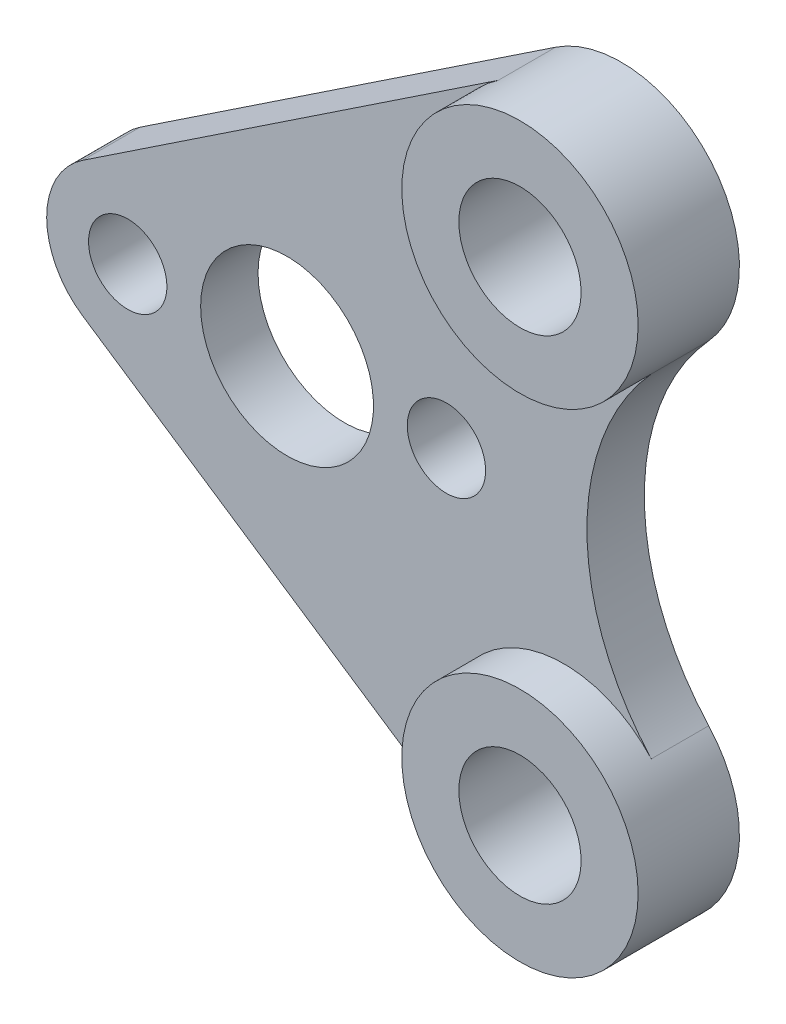
ISO-10303-21;
HEADER;
FILE_DESCRIPTION(('STEP AP214'),'2;1');
FILE_NAME('part.step','',(''),(''),'','','');
FILE_SCHEMA(('AUTOMOTIVE_DESIGN { 1 0 10303 214 1 1 1 1 }'));
ENDSEC;
DATA;
#1=APPLICATION_CONTEXT('core data for automotive mechanical design processes');
#2=APPLICATION_PROTOCOL_DEFINITION('international standard','automotive_design',2000,#1);
#3=PRODUCT_CONTEXT('',#1,'mechanical');
#4=PRODUCT('Part','Part','',(#3));
#5=PRODUCT_RELATED_PRODUCT_CATEGORY('part','',(#4));
#6=PRODUCT_DEFINITION_FORMATION('','',#4);
#7=PRODUCT_DEFINITION_CONTEXT('part definition',#1,'design');
#8=PRODUCT_DEFINITION('design','',#6,#7);
#9=PRODUCT_DEFINITION_SHAPE('','',#8);
#10=(LENGTH_UNIT() NAMED_UNIT(*) SI_UNIT(.MILLI.,.METRE.));
#11=(NAMED_UNIT(*) PLANE_ANGLE_UNIT() SI_UNIT($,.RADIAN.));
#12=(NAMED_UNIT(*) SI_UNIT($,.STERADIAN.) SOLID_ANGLE_UNIT());
#13=UNCERTAINTY_MEASURE_WITH_UNIT(LENGTH_MEASURE(1.E-05),#10,'distance_accuracy_value','');
#14=(GEOMETRIC_REPRESENTATION_CONTEXT(3) GLOBAL_UNCERTAINTY_ASSIGNED_CONTEXT((#13)) GLOBAL_UNIT_ASSIGNED_CONTEXT((#10,
#11,#12)) REPRESENTATION_CONTEXT('',''));
#15=CARTESIAN_POINT('',(0.,0.,0.));
#16=DIRECTION('',(0.,0.,1.));
#17=DIRECTION('',(1.,0.,0.));
#18=AXIS2_PLACEMENT_3D('',#15,#16,#17);
#19=CARTESIAN_POINT('',(10.4106540966454,9.2583,3.81));
#20=DIRECTION('',(0.,0.,1.));
#21=DIRECTION('',(1.,0.,0.));
#22=AXIS2_PLACEMENT_3D('',#19,#20,#21);
#23=PLANE('',#22);
#24=CARTESIAN_POINT('',(10.4106540966454,-9.2583,3.81));
#25=DIRECTION('',(0.,0.,1.));
#26=DIRECTION('',(1.,0.,0.));
#27=AXIS2_PLACEMENT_3D('',#24,#25,#26);
#28=CIRCLE('',#27,2.2987);
#29=CARTESIAN_POINT('',(8.11195409664542,-9.2583,3.81));
#30=VERTEX_POINT('',#29);
#31=EDGE_CURVE('E168',#30,#30,#28,.T.);
#32=ORIENTED_EDGE('',*,*,#31,.F.);
#33=EDGE_LOOP('',(#32));
#34=FACE_BOUND('',#33,.T.);
#35=CARTESIAN_POINT('',(10.4106540966454,-9.2583,3.81));
#36=DIRECTION('',(0.,0.,1.));
#37=DIRECTION('',(1.,0.,0.));
#38=AXIS2_PLACEMENT_3D('',#35,#36,#37);
#39=CIRCLE('',#38,4.445);
#40=CARTESIAN_POINT('',(14.8556540966454,-9.2583,3.81));
#41=VERTEX_POINT('',#40);
#42=EDGE_CURVE('E116',#41,#41,#39,.T.);
#43=ORIENTED_EDGE('',*,*,#42,.T.);
#44=EDGE_LOOP('',(#43));
#45=FACE_BOUND('',#44,.T.);
#46=ADVANCED_FACE('F35',(#34,#45),#23,.T.);
#47=CARTESIAN_POINT('',(10.4106540966454,9.2583,3.81));
#48=DIRECTION('',(0.,0.,1.));
#49=DIRECTION('',(1.,0.,0.));
#50=AXIS2_PLACEMENT_3D('',#47,#48,#49);
#51=CIRCLE('',#50,2.2987);
#52=CARTESIAN_POINT('',(8.11195409664542,9.2583,3.81));
#53=VERTEX_POINT('',#52);
#54=EDGE_CURVE('E162',#53,#53,#51,.T.);
#55=ORIENTED_EDGE('',*,*,#54,.F.);
#56=EDGE_LOOP('',(#55));
#57=FACE_BOUND('',#56,.T.);
#58=CARTESIAN_POINT('',(10.4106540966454,9.2583,3.81));
#59=DIRECTION('',(0.,0.,1.));
#60=DIRECTION('',(1.,0.,0.));
#61=AXIS2_PLACEMENT_3D('',#58,#59,#60);
#62=CIRCLE('',#61,4.445);
#63=CARTESIAN_POINT('',(14.8556540966454,9.2583,3.81));
#64=VERTEX_POINT('',#63);
#65=EDGE_CURVE('E129',#64,#64,#62,.T.);
#66=ORIENTED_EDGE('',*,*,#65,.T.);
#67=EDGE_LOOP('',(#66));
#68=FACE_BOUND('',#67,.T.);
#69=ADVANCED_FACE('F199',(#57,#68),#23,.T.);
#70=CARTESIAN_POINT('',(7.94491633433064,12.9566999631591,3.81));
#71=DIRECTION('',(0.554721656313787,-0.832035987212385,0.));
#72=DIRECTION('',(0.832035987212385,0.554721656313787,0.));
#73=AXIS2_PLACEMENT_3D('',#70,#71,#72);
#74=PLANE('',#73);
#75=DIRECTION('',(0.832035987212385,0.554721656313787,0.));
#76=VECTOR('',#75,1.);
#77=CARTESIAN_POINT('',(7.94491633433064,12.956699963159,2.159));
#78=LINE('',#77,#76);
#79=CARTESIAN_POINT('',(-7.68519160844442,2.53604568902335,2.159));
#80=VERTEX_POINT('',#79);
#81=CARTESIAN_POINT('',(7.94491633433064,12.956699963159,2.159));
#82=VERTEX_POINT('',#81);
#83=EDGE_CURVE('E90',#80,#82,#78,.T.);
#84=ORIENTED_EDGE('',*,*,#83,.T.);
#85=DIRECTION('',(0.,0.,-1.));
#86=VECTOR('',#85,1.);
#87=CARTESIAN_POINT('',(7.94491633433064,12.9566999631591,3.81));
#88=LINE('',#87,#86);
#89=CARTESIAN_POINT('',(7.94491633433064,12.9566999631591,0.));
#90=VERTEX_POINT('',#89);
#91=EDGE_CURVE('E12',#82,#90,#88,.T.);
#92=ORIENTED_EDGE('',*,*,#91,.T.);
#93=DIRECTION('',(-0.832035987212385,-0.554721656313787,0.));
#94=VECTOR('',#93,1.);
#95=CARTESIAN_POINT('',(7.94491633433064,12.9566999631591,0.));
#96=LINE('',#95,#94);
#97=CARTESIAN_POINT('',(-7.68519160844442,2.53604568902335,0.));
#98=VERTEX_POINT('',#97);
#99=EDGE_CURVE('E107',#90,#98,#96,.T.);
#100=ORIENTED_EDGE('',*,*,#99,.T.);
#101=DIRECTION('',(0.,0.,-1.));
#102=VECTOR('',#101,1.);
#103=CARTESIAN_POINT('',(-7.68519160844442,2.53604568902335,3.81));
#104=LINE('',#103,#102);
#105=EDGE_CURVE('E44',#80,#98,#104,.T.);
#106=ORIENTED_EDGE('',*,*,#105,.F.);
#107=EDGE_LOOP('',(#84,#92,#100,#106));
#108=FACE_BOUND('',#107,.T.);
#109=ADVANCED_FACE('F97',(#108),#74,.F.);
#110=CARTESIAN_POINT('',(-5.9944,0.,3.81));
#111=DIRECTION('',(0.,0.,-1.));
#112=DIRECTION('',(-1.,0.,0.));
#113=AXIS2_PLACEMENT_3D('',#110,#111,#112);
#114=CYLINDRICAL_SURFACE('',#113,3.048);
#115=CARTESIAN_POINT('',(-5.9944,0.,2.159));
#116=DIRECTION('',(0.,0.,1.));
#117=DIRECTION('',(1.,0.,0.));
#118=AXIS2_PLACEMENT_3D('',#115,#116,#117);
#119=CIRCLE('',#118,3.048);
#120=CARTESIAN_POINT('',(-7.68519160844442,-2.53604568902335,2.159));
#121=VERTEX_POINT('',#120);
#122=EDGE_CURVE('E100',#121,#80,#119,.F.);
#123=ORIENTED_EDGE('',*,*,#122,.T.);
#124=ORIENTED_EDGE('',*,*,#105,.T.);
#125=CARTESIAN_POINT('',(-5.9944,0.,0.));
#126=DIRECTION('',(0.,0.,1.));
#127=DIRECTION('',(1.,0.,0.));
#128=AXIS2_PLACEMENT_3D('',#125,#126,#127);
#129=CIRCLE('',#128,3.048);
#130=CARTESIAN_POINT('',(-7.68519160844442,-2.53604568902335,0.));
#131=VERTEX_POINT('',#130);
#132=EDGE_CURVE('E110',#98,#131,#129,.T.);
#133=ORIENTED_EDGE('',*,*,#132,.T.);
#134=DIRECTION('',(0.,0.,-1.));
#135=VECTOR('',#134,1.);
#136=CARTESIAN_POINT('',(-7.68519160844442,-2.53604568902335,3.81));
#137=LINE('',#136,#135);
#138=EDGE_CURVE('E135',#121,#131,#137,.T.);
#139=ORIENTED_EDGE('',*,*,#138,.F.);
#140=EDGE_LOOP('',(#123,#124,#133,#139));
#141=FACE_BOUND('',#140,.T.);
#142=ADVANCED_FACE('F138',(#141),#114,.T.);
#143=CARTESIAN_POINT('',(-7.68519160844442,-2.53604568902335,3.81));
#144=DIRECTION('',(0.554721656313787,0.832035987212385,0.));
#145=DIRECTION('',(-0.832035987212385,0.554721656313787,0.));
#146=AXIS2_PLACEMENT_3D('',#143,#144,#145);
#147=PLANE('',#146);
#148=DIRECTION('',(-0.832035987212385,0.554721656313787,0.));
#149=VECTOR('',#148,1.);
#150=CARTESIAN_POINT('',(-7.68519160844442,-2.53604568902335,2.159));
#151=LINE('',#150,#149);
#152=CARTESIAN_POINT('',(7.94491633433064,-12.956699963159,2.159));
#153=VERTEX_POINT('',#152);
#154=EDGE_CURVE('E149',#153,#121,#151,.T.);
#155=ORIENTED_EDGE('',*,*,#154,.T.);
#156=ORIENTED_EDGE('',*,*,#138,.T.);
#157=DIRECTION('',(0.832035987212385,-0.554721656313787,0.));
#158=VECTOR('',#157,1.);
#159=CARTESIAN_POINT('',(-7.68519160844442,-2.53604568902335,0.));
#160=LINE('',#159,#158);
#161=CARTESIAN_POINT('',(7.94491633433064,-12.9566999631591,0.));
#162=VERTEX_POINT('',#161);
#163=EDGE_CURVE('E121',#131,#162,#160,.T.);
#164=ORIENTED_EDGE('',*,*,#163,.T.);
#165=DIRECTION('',(0.,0.,-1.));
#166=VECTOR('',#165,1.);
#167=CARTESIAN_POINT('',(7.94491633433064,-12.9566999631591,3.81));
#168=LINE('',#167,#166);
#169=EDGE_CURVE('E133',#153,#162,#168,.T.);
#170=ORIENTED_EDGE('',*,*,#169,.F.);
#171=EDGE_LOOP('',(#155,#156,#164,#170));
#172=FACE_BOUND('',#171,.T.);
#173=ADVANCED_FACE('F148',(#172),#147,.F.);
#174=CARTESIAN_POINT('',(20.5996626753361,0.,3.81));
#175=DIRECTION('',(0.,0.,-1.));
#176=DIRECTION('',(-1.,0.,0.));
#177=AXIS2_PLACEMENT_3D('',#174,#175,#176);
#178=CYLINDRICAL_SURFACE('',#177,9.32206267533609);
#179=CARTESIAN_POINT('',(20.5996626753361,0.,2.159));
#180=DIRECTION('',(0.,0.,1.));
#181=DIRECTION('',(1.,0.,0.));
#182=AXIS2_PLACEMENT_3D('',#179,#180,#181);
#183=CIRCLE('',#182,9.32206267533609);
#184=CARTESIAN_POINT('',(13.7004003700766,6.26905353032811,2.159));
#185=VERTEX_POINT('',#184);
#186=CARTESIAN_POINT('',(13.7004003700766,-6.26905353032811,2.159));
#187=VERTEX_POINT('',#186);
#188=EDGE_CURVE('E92',#185,#187,#183,.T.);
#189=ORIENTED_EDGE('',*,*,#188,.T.);
#190=DIRECTION('',(0.,0.,-1.));
#191=VECTOR('',#190,1.);
#192=CARTESIAN_POINT('',(13.7004003700766,-6.26905353032811,3.81));
#193=LINE('',#192,#191);
#194=CARTESIAN_POINT('',(13.7004003700766,-6.26905353032811,0.));
#195=VERTEX_POINT('',#194);
#196=EDGE_CURVE('E131',#187,#195,#193,.T.);
#197=ORIENTED_EDGE('',*,*,#196,.T.);
#198=CARTESIAN_POINT('',(20.5996626753361,0.,0.));
#199=DIRECTION('',(0.,0.,-1.));
#200=DIRECTION('',(1.,0.,0.));
#201=AXIS2_PLACEMENT_3D('',#198,#199,#200);
#202=CIRCLE('',#201,9.32206267533609);
#203=CARTESIAN_POINT('',(13.7004003700766,6.26905353032812,0.));
#204=VERTEX_POINT('',#203);
#205=EDGE_CURVE('E127',#195,#204,#202,.T.);
#206=ORIENTED_EDGE('',*,*,#205,.T.);
#207=DIRECTION('',(0.,0.,-1.));
#208=VECTOR('',#207,1.);
#209=CARTESIAN_POINT('',(13.7004003700766,6.26905353032812,3.81));
#210=LINE('',#209,#208);
#211=EDGE_CURVE('E59',#185,#204,#210,.T.);
#212=ORIENTED_EDGE('',*,*,#211,.F.);
#213=EDGE_LOOP('',(#189,#197,#206,#212));
#214=FACE_BOUND('',#213,.T.);
#215=ADVANCED_FACE('F213',(#214),#178,.F.);
#216=CARTESIAN_POINT('',(0.,0.,3.81));
#217=DIRECTION('',(0.,0.,-1.));
#218=DIRECTION('',(-1.,0.,0.));
#219=AXIS2_PLACEMENT_3D('',#216,#217,#218);
#220=CYLINDRICAL_SURFACE('',#219,3.2512);
#221=CARTESIAN_POINT('',(0.,0.,0.));
#222=DIRECTION('',(0.,0.,1.));
#223=DIRECTION('',(1.,0.,0.));
#224=AXIS2_PLACEMENT_3D('',#221,#222,#223);
#225=CIRCLE('',#224,3.2512);
#226=CARTESIAN_POINT('',(-3.2512,0.,0.));
#227=VERTEX_POINT('',#226);
#228=EDGE_CURVE('E108',#227,#227,#225,.T.);
#229=CARTESIAN_POINT('',(0.,0.,2.159));
#230=DIRECTION('',(0.,0.,1.));
#231=DIRECTION('',(1.,0.,0.));
#232=AXIS2_PLACEMENT_3D('',#229,#230,#231);
#233=CIRCLE('',#232,3.2512);
#234=CARTESIAN_POINT('',(-3.2512,0.,2.159));
#235=VERTEX_POINT('',#234);
#236=EDGE_CURVE('E158',#235,#235,#233,.T.);
#237=CARTESIAN_POINT('',(-3.2512,0.,0.));
#238=CARTESIAN_POINT('',(-3.2512,0.,0.0224895833333333));
#239=CARTESIAN_POINT('',(-3.2512,0.,0.0449791666666665));
#240=CARTESIAN_POINT('',(-3.2512,0.,0.0899583333333332));
#241=CARTESIAN_POINT('',(-3.2512,0.,0.112447916666667));
#242=CARTESIAN_POINT('',(-3.2512,0.,0.157427083333333));
#243=CARTESIAN_POINT('',(-3.2512,0.,0.179916666666667));
#244=CARTESIAN_POINT('',(-3.2512,0.,0.224895833333333));
#245=CARTESIAN_POINT('',(-3.2512,0.,0.247385416666667));
#246=CARTESIAN_POINT('',(-3.2512,0.,0.292364583333333));
#247=CARTESIAN_POINT('',(-3.2512,0.,0.314854166666667));
#248=CARTESIAN_POINT('',(-3.2512,0.,0.359833333333333));
#249=CARTESIAN_POINT('',(-3.2512,0.,0.382322916666667));
#250=CARTESIAN_POINT('',(-3.2512,0.,0.427302083333333));
#251=CARTESIAN_POINT('',(-3.2512,0.,0.449791666666667));
#252=CARTESIAN_POINT('',(-3.2512,0.,0.494770833333333));
#253=CARTESIAN_POINT('',(-3.2512,0.,0.517260416666667));
#254=CARTESIAN_POINT('',(-3.2512,0.,0.562239583333333));
#255=CARTESIAN_POINT('',(-3.2512,0.,0.584729166666667));
#256=CARTESIAN_POINT('',(-3.2512,0.,0.629708333333333));
#257=CARTESIAN_POINT('',(-3.2512,0.,0.652197916666667));
#258=CARTESIAN_POINT('',(-3.2512,0.,0.697177083333333));
#259=CARTESIAN_POINT('',(-3.2512,0.,0.719666666666667));
#260=CARTESIAN_POINT('',(-3.2512,0.,0.764645833333333));
#261=CARTESIAN_POINT('',(-3.2512,0.,0.787135416666667));
#262=CARTESIAN_POINT('',(-3.2512,0.,0.832114583333333));
#263=CARTESIAN_POINT('',(-3.2512,0.,0.854604166666667));
#264=CARTESIAN_POINT('',(-3.2512,0.,0.899583333333333));
#265=CARTESIAN_POINT('',(-3.2512,0.,0.922072916666667));
#266=CARTESIAN_POINT('',(-3.2512,0.,0.967052083333333));
#267=CARTESIAN_POINT('',(-3.2512,0.,0.989541666666667));
#268=CARTESIAN_POINT('',(-3.2512,0.,1.03452083333333));
#269=CARTESIAN_POINT('',(-3.2512,0.,1.05701041666667));
#270=CARTESIAN_POINT('',(-3.2512,0.,1.10198958333333));
#271=CARTESIAN_POINT('',(-3.2512,0.,1.12447916666667));
#272=CARTESIAN_POINT('',(-3.2512,0.,1.16945833333333));
#273=CARTESIAN_POINT('',(-3.2512,0.,1.19194791666667));
#274=CARTESIAN_POINT('',(-3.2512,0.,1.23692708333333));
#275=CARTESIAN_POINT('',(-3.2512,0.,1.25941666666667));
#276=CARTESIAN_POINT('',(-3.2512,0.,1.30439583333333));
#277=CARTESIAN_POINT('',(-3.2512,0.,1.32688541666667));
#278=CARTESIAN_POINT('',(-3.2512,0.,1.37186458333333));
#279=CARTESIAN_POINT('',(-3.2512,0.,1.39435416666667));
#280=CARTESIAN_POINT('',(-3.2512,0.,1.43933333333333));
#281=CARTESIAN_POINT('',(-3.2512,0.,1.46182291666667));
#282=CARTESIAN_POINT('',(-3.2512,0.,1.50680208333333));
#283=CARTESIAN_POINT('',(-3.2512,0.,1.52929166666667));
#284=CARTESIAN_POINT('',(-3.2512,0.,1.57427083333333));
#285=CARTESIAN_POINT('',(-3.2512,0.,1.59676041666667));
#286=CARTESIAN_POINT('',(-3.2512,0.,1.64173958333333));
#287=CARTESIAN_POINT('',(-3.2512,0.,1.66422916666667));
#288=CARTESIAN_POINT('',(-3.2512,0.,1.70920833333333));
#289=CARTESIAN_POINT('',(-3.2512,0.,1.73169791666667));
#290=CARTESIAN_POINT('',(-3.2512,0.,1.77667708333333));
#291=CARTESIAN_POINT('',(-3.2512,0.,1.79916666666667));
#292=CARTESIAN_POINT('',(-3.2512,0.,1.84414583333333));
#293=CARTESIAN_POINT('',(-3.2512,0.,1.86663541666667));
#294=CARTESIAN_POINT('',(-3.2512,0.,1.91161458333333));
#295=CARTESIAN_POINT('',(-3.2512,0.,1.93410416666667));
#296=CARTESIAN_POINT('',(-3.2512,0.,1.97908333333333));
#297=CARTESIAN_POINT('',(-3.2512,0.,2.00157291666667));
#298=CARTESIAN_POINT('',(-3.2512,0.,2.04655208333333));
#299=CARTESIAN_POINT('',(-3.2512,0.,2.06904166666667));
#300=CARTESIAN_POINT('',(-3.2512,0.,2.11402083333333));
#301=CARTESIAN_POINT('',(-3.2512,0.,2.13651041666667));
#302=CARTESIAN_POINT('',(-3.2512,0.,2.159));
#303=B_SPLINE_CURVE_WITH_KNOTS('',3,(#237,#238,#239,#240,#241,#242,#243,#244,#245,#246,#247,
#248,#249,#250,#251,#252,#253,#254,#255,#256,#257,#258,#259,#260,#261,#262,#263,#264,#265,#266,
#267,#268,#269,#270,#271,#272,#273,#274,#275,#276,#277,#278,#279,#280,#281,#282,#283,#284,#285,
#286,#287,#288,#289,#290,#291,#292,#293,#294,#295,#296,#297,#298,#299,#300,#301,#302),
.UNSPECIFIED.,.F.,.F.,(4,2,2,2,2,2,2,2,2,2,2,2,2,2,2,2,2,2,2,2,2,2,2,2,2,2,2,2,2,2,2,2,4),(0.,
0.0674687499999998,0.1349375,0.20240625,0.269875,0.33734375,0.4048125,0.47228125,0.53975,
0.60721875,0.6746875,0.74215625,0.809625,0.87709375,0.9445625,1.01203125,1.0795,1.14696875,
1.2144375,1.28190625,1.349375,1.41684375,1.4843125,1.55178125,1.61925,1.68671875,1.7541875,
1.82165625,1.889125,1.95659375,2.0240625,2.09153125,2.159),.UNSPECIFIED.);
#304=EDGE_CURVE('BSEAM209',#227,#235,#303,.T.);
#305=ORIENTED_EDGE('',*,*,#228,.F.);
#306=ORIENTED_EDGE('',*,*,#236,.T.);
#307=ORIENTED_EDGE('',*,*,#304,.T.);
#308=ORIENTED_EDGE('',*,*,#304,.F.);
#309=EDGE_LOOP('',(#305,#307,#306,#308));
#310=FACE_BOUND('',#309,.T.);
#311=ADVANCED_FACE('F209',(#310),#220,.F.);
#312=CARTESIAN_POINT('',(-5.9944,0.,3.81));
#313=DIRECTION('',(0.,0.,-1.));
#314=DIRECTION('',(-1.,0.,0.));
#315=AXIS2_PLACEMENT_3D('',#312,#313,#314);
#316=CYLINDRICAL_SURFACE('',#315,1.4732);
#317=CARTESIAN_POINT('',(-5.9944,0.,0.));
#318=DIRECTION('',(0.,0.,1.));
#319=DIRECTION('',(1.,0.,0.));
#320=AXIS2_PLACEMENT_3D('',#317,#318,#319);
#321=CIRCLE('',#320,1.4732);
#322=CARTESIAN_POINT('',(-7.4676,0.,0.));
#323=VERTEX_POINT('',#322);
#324=EDGE_CURVE('E113',#323,#323,#321,.T.);
#325=CARTESIAN_POINT('',(-5.9944,0.,2.159));
#326=DIRECTION('',(0.,0.,1.));
#327=DIRECTION('',(1.,0.,0.));
#328=AXIS2_PLACEMENT_3D('',#325,#326,#327);
#329=CIRCLE('',#328,1.4732);
#330=CARTESIAN_POINT('',(-7.4676,0.,2.159));
#331=VERTEX_POINT('',#330);
#332=EDGE_CURVE('E155',#331,#331,#329,.T.);
#333=CARTESIAN_POINT('',(-7.4676,0.,0.));
#334=CARTESIAN_POINT('',(-7.4676,0.,0.0224895833333333));
#335=CARTESIAN_POINT('',(-7.4676,0.,0.0449791666666665));
#336=CARTESIAN_POINT('',(-7.4676,0.,0.0899583333333332));
#337=CARTESIAN_POINT('',(-7.4676,0.,0.112447916666667));
#338=CARTESIAN_POINT('',(-7.4676,0.,0.157427083333333));
#339=CARTESIAN_POINT('',(-7.4676,0.,0.179916666666667));
#340=CARTESIAN_POINT('',(-7.4676,0.,0.224895833333333));
#341=CARTESIAN_POINT('',(-7.4676,0.,0.247385416666667));
#342=CARTESIAN_POINT('',(-7.4676,0.,0.292364583333333));
#343=CARTESIAN_POINT('',(-7.4676,0.,0.314854166666667));
#344=CARTESIAN_POINT('',(-7.4676,0.,0.359833333333333));
#345=CARTESIAN_POINT('',(-7.4676,0.,0.382322916666667));
#346=CARTESIAN_POINT('',(-7.4676,0.,0.427302083333333));
#347=CARTESIAN_POINT('',(-7.4676,0.,0.449791666666667));
#348=CARTESIAN_POINT('',(-7.4676,0.,0.494770833333333));
#349=CARTESIAN_POINT('',(-7.4676,0.,0.517260416666667));
#350=CARTESIAN_POINT('',(-7.4676,0.,0.562239583333333));
#351=CARTESIAN_POINT('',(-7.4676,0.,0.584729166666667));
#352=CARTESIAN_POINT('',(-7.4676,0.,0.629708333333333));
#353=CARTESIAN_POINT('',(-7.4676,0.,0.652197916666667));
#354=CARTESIAN_POINT('',(-7.4676,0.,0.697177083333333));
#355=CARTESIAN_POINT('',(-7.4676,0.,0.719666666666667));
#356=CARTESIAN_POINT('',(-7.4676,0.,0.764645833333333));
#357=CARTESIAN_POINT('',(-7.4676,0.,0.787135416666667));
#358=CARTESIAN_POINT('',(-7.4676,0.,0.832114583333333));
#359=CARTESIAN_POINT('',(-7.4676,0.,0.854604166666667));
#360=CARTESIAN_POINT('',(-7.4676,0.,0.899583333333333));
#361=CARTESIAN_POINT('',(-7.4676,0.,0.922072916666667));
#362=CARTESIAN_POINT('',(-7.4676,0.,0.967052083333333));
#363=CARTESIAN_POINT('',(-7.4676,0.,0.989541666666667));
#364=CARTESIAN_POINT('',(-7.4676,0.,1.03452083333333));
#365=CARTESIAN_POINT('',(-7.4676,0.,1.05701041666667));
#366=CARTESIAN_POINT('',(-7.4676,0.,1.10198958333333));
#367=CARTESIAN_POINT('',(-7.4676,0.,1.12447916666667));
#368=CARTESIAN_POINT('',(-7.4676,0.,1.16945833333333));
#369=CARTESIAN_POINT('',(-7.4676,0.,1.19194791666667));
#370=CARTESIAN_POINT('',(-7.4676,0.,1.23692708333333));
#371=CARTESIAN_POINT('',(-7.4676,0.,1.25941666666667));
#372=CARTESIAN_POINT('',(-7.4676,0.,1.30439583333333));
#373=CARTESIAN_POINT('',(-7.4676,0.,1.32688541666667));
#374=CARTESIAN_POINT('',(-7.4676,0.,1.37186458333333));
#375=CARTESIAN_POINT('',(-7.4676,0.,1.39435416666667));
#376=CARTESIAN_POINT('',(-7.4676,0.,1.43933333333333));
#377=CARTESIAN_POINT('',(-7.4676,0.,1.46182291666667));
#378=CARTESIAN_POINT('',(-7.4676,0.,1.50680208333333));
#379=CARTESIAN_POINT('',(-7.4676,0.,1.52929166666667));
#380=CARTESIAN_POINT('',(-7.4676,0.,1.57427083333333));
#381=CARTESIAN_POINT('',(-7.4676,0.,1.59676041666667));
#382=CARTESIAN_POINT('',(-7.4676,0.,1.64173958333333));
#383=CARTESIAN_POINT('',(-7.4676,0.,1.66422916666667));
#384=CARTESIAN_POINT('',(-7.4676,0.,1.70920833333333));
#385=CARTESIAN_POINT('',(-7.4676,0.,1.73169791666667));
#386=CARTESIAN_POINT('',(-7.4676,0.,1.77667708333333));
#387=CARTESIAN_POINT('',(-7.4676,0.,1.79916666666667));
#388=CARTESIAN_POINT('',(-7.4676,0.,1.84414583333333));
#389=CARTESIAN_POINT('',(-7.4676,0.,1.86663541666667));
#390=CARTESIAN_POINT('',(-7.4676,0.,1.91161458333333));
#391=CARTESIAN_POINT('',(-7.4676,0.,1.93410416666667));
#392=CARTESIAN_POINT('',(-7.4676,0.,1.97908333333333));
#393=CARTESIAN_POINT('',(-7.4676,0.,2.00157291666667));
#394=CARTESIAN_POINT('',(-7.4676,0.,2.04655208333333));
#395=CARTESIAN_POINT('',(-7.4676,0.,2.06904166666667));
#396=CARTESIAN_POINT('',(-7.4676,0.,2.11402083333333));
#397=CARTESIAN_POINT('',(-7.4676,0.,2.13651041666667));
#398=CARTESIAN_POINT('',(-7.4676,0.,2.159));
#399=B_SPLINE_CURVE_WITH_KNOTS('',3,(#333,#334,#335,#336,#337,#338,#339,#340,#341,#342,#343,
#344,#345,#346,#347,#348,#349,#350,#351,#352,#353,#354,#355,#356,#357,#358,#359,#360,#361,#362,
#363,#364,#365,#366,#367,#368,#369,#370,#371,#372,#373,#374,#375,#376,#377,#378,#379,#380,#381,
#382,#383,#384,#385,#386,#387,#388,#389,#390,#391,#392,#393,#394,#395,#396,#397,#398),
.UNSPECIFIED.,.F.,.F.,(4,2,2,2,2,2,2,2,2,2,2,2,2,2,2,2,2,2,2,2,2,2,2,2,2,2,2,2,2,2,2,2,4),(0.,
0.0674687499999998,0.1349375,0.20240625,0.269875,0.33734375,0.4048125,0.47228125,0.53975,
0.60721875,0.6746875,0.74215625,0.809625,0.87709375,0.9445625,1.01203125,1.0795,1.14696875,
1.2144375,1.28190625,1.349375,1.41684375,1.4843125,1.55178125,1.61925,1.68671875,1.7541875,
1.82165625,1.889125,1.95659375,2.0240625,2.09153125,2.159),.UNSPECIFIED.);
#400=EDGE_CURVE('BSEAM220',#323,#331,#399,.T.);
#401=ORIENTED_EDGE('',*,*,#324,.F.);
#402=ORIENTED_EDGE('',*,*,#332,.T.);
#403=ORIENTED_EDGE('',*,*,#400,.T.);
#404=ORIENTED_EDGE('',*,*,#400,.F.);
#405=EDGE_LOOP('',(#401,#403,#402,#404));
#406=FACE_BOUND('',#405,.T.);
#407=ADVANCED_FACE('F220',(#406),#316,.F.);
#408=CARTESIAN_POINT('',(5.9944,0.,3.81));
#409=DIRECTION('',(0.,0.,-1.));
#410=DIRECTION('',(-1.,0.,0.));
#411=AXIS2_PLACEMENT_3D('',#408,#409,#410);
#412=CYLINDRICAL_SURFACE('',#411,1.4732);
#413=CARTESIAN_POINT('',(5.9944,0.,0.));
#414=DIRECTION('',(0.,0.,1.));
#415=DIRECTION('',(1.,0.,0.));
#416=AXIS2_PLACEMENT_3D('',#413,#414,#415);
#417=CIRCLE('',#416,1.4732);
#418=CARTESIAN_POINT('',(4.5212,0.,0.));
#419=VERTEX_POINT('',#418);
#420=EDGE_CURVE('E171',#419,#419,#417,.T.);
#421=CARTESIAN_POINT('',(5.9944,0.,2.159));
#422=DIRECTION('',(0.,0.,1.));
#423=DIRECTION('',(1.,0.,0.));
#424=AXIS2_PLACEMENT_3D('',#421,#422,#423);
#425=CIRCLE('',#424,1.4732);
#426=CARTESIAN_POINT('',(4.5212,0.,2.159));
#427=VERTEX_POINT('',#426);
#428=EDGE_CURVE('E39',#427,#427,#425,.T.);
#429=CARTESIAN_POINT('',(4.5212,0.,0.));
#430=CARTESIAN_POINT('',(4.5212,0.,0.0224895833333333));
#431=CARTESIAN_POINT('',(4.5212,0.,0.0449791666666665));
#432=CARTESIAN_POINT('',(4.5212,0.,0.0899583333333332));
#433=CARTESIAN_POINT('',(4.5212,0.,0.112447916666667));
#434=CARTESIAN_POINT('',(4.5212,0.,0.157427083333333));
#435=CARTESIAN_POINT('',(4.5212,0.,0.179916666666667));
#436=CARTESIAN_POINT('',(4.5212,0.,0.224895833333333));
#437=CARTESIAN_POINT('',(4.5212,0.,0.247385416666667));
#438=CARTESIAN_POINT('',(4.5212,0.,0.292364583333333));
#439=CARTESIAN_POINT('',(4.5212,0.,0.314854166666667));
#440=CARTESIAN_POINT('',(4.5212,0.,0.359833333333333));
#441=CARTESIAN_POINT('',(4.5212,0.,0.382322916666667));
#442=CARTESIAN_POINT('',(4.5212,0.,0.427302083333333));
#443=CARTESIAN_POINT('',(4.5212,0.,0.449791666666667));
#444=CARTESIAN_POINT('',(4.5212,0.,0.494770833333333));
#445=CARTESIAN_POINT('',(4.5212,0.,0.517260416666667));
#446=CARTESIAN_POINT('',(4.5212,0.,0.562239583333333));
#447=CARTESIAN_POINT('',(4.5212,0.,0.584729166666667));
#448=CARTESIAN_POINT('',(4.5212,0.,0.629708333333333));
#449=CARTESIAN_POINT('',(4.5212,0.,0.652197916666667));
#450=CARTESIAN_POINT('',(4.5212,0.,0.697177083333333));
#451=CARTESIAN_POINT('',(4.5212,0.,0.719666666666667));
#452=CARTESIAN_POINT('',(4.5212,0.,0.764645833333333));
#453=CARTESIAN_POINT('',(4.5212,0.,0.787135416666667));
#454=CARTESIAN_POINT('',(4.5212,0.,0.832114583333333));
#455=CARTESIAN_POINT('',(4.5212,0.,0.854604166666667));
#456=CARTESIAN_POINT('',(4.5212,0.,0.899583333333333));
#457=CARTESIAN_POINT('',(4.5212,0.,0.922072916666667));
#458=CARTESIAN_POINT('',(4.5212,0.,0.967052083333333));
#459=CARTESIAN_POINT('',(4.5212,0.,0.989541666666667));
#460=CARTESIAN_POINT('',(4.5212,0.,1.03452083333333));
#461=CARTESIAN_POINT('',(4.5212,0.,1.05701041666667));
#462=CARTESIAN_POINT('',(4.5212,0.,1.10198958333333));
#463=CARTESIAN_POINT('',(4.5212,0.,1.12447916666667));
#464=CARTESIAN_POINT('',(4.5212,0.,1.16945833333333));
#465=CARTESIAN_POINT('',(4.5212,0.,1.19194791666667));
#466=CARTESIAN_POINT('',(4.5212,0.,1.23692708333333));
#467=CARTESIAN_POINT('',(4.5212,0.,1.25941666666667));
#468=CARTESIAN_POINT('',(4.5212,0.,1.30439583333333));
#469=CARTESIAN_POINT('',(4.5212,0.,1.32688541666667));
#470=CARTESIAN_POINT('',(4.5212,0.,1.37186458333333));
#471=CARTESIAN_POINT('',(4.5212,0.,1.39435416666667));
#472=CARTESIAN_POINT('',(4.5212,0.,1.43933333333333));
#473=CARTESIAN_POINT('',(4.5212,0.,1.46182291666667));
#474=CARTESIAN_POINT('',(4.5212,0.,1.50680208333333));
#475=CARTESIAN_POINT('',(4.5212,0.,1.52929166666667));
#476=CARTESIAN_POINT('',(4.5212,0.,1.57427083333333));
#477=CARTESIAN_POINT('',(4.5212,0.,1.59676041666667));
#478=CARTESIAN_POINT('',(4.5212,0.,1.64173958333333));
#479=CARTESIAN_POINT('',(4.5212,0.,1.66422916666667));
#480=CARTESIAN_POINT('',(4.5212,0.,1.70920833333333));
#481=CARTESIAN_POINT('',(4.5212,0.,1.73169791666667));
#482=CARTESIAN_POINT('',(4.5212,0.,1.77667708333333));
#483=CARTESIAN_POINT('',(4.5212,0.,1.79916666666667));
#484=CARTESIAN_POINT('',(4.5212,0.,1.84414583333333));
#485=CARTESIAN_POINT('',(4.5212,0.,1.86663541666667));
#486=CARTESIAN_POINT('',(4.5212,0.,1.91161458333333));
#487=CARTESIAN_POINT('',(4.5212,0.,1.93410416666667));
#488=CARTESIAN_POINT('',(4.5212,0.,1.97908333333333));
#489=CARTESIAN_POINT('',(4.5212,0.,2.00157291666667));
#490=CARTESIAN_POINT('',(4.5212,0.,2.04655208333333));
#491=CARTESIAN_POINT('',(4.5212,0.,2.06904166666667));
#492=CARTESIAN_POINT('',(4.5212,0.,2.11402083333333));
#493=CARTESIAN_POINT('',(4.5212,0.,2.13651041666667));
#494=CARTESIAN_POINT('',(4.5212,0.,2.159));
#495=B_SPLINE_CURVE_WITH_KNOTS('',3,(#429,#430,#431,#432,#433,#434,#435,#436,#437,#438,#439,
#440,#441,#442,#443,#444,#445,#446,#447,#448,#449,#450,#451,#452,#453,#454,#455,#456,#457,#458,
#459,#460,#461,#462,#463,#464,#465,#466,#467,#468,#469,#470,#471,#472,#473,#474,#475,#476,#477,
#478,#479,#480,#481,#482,#483,#484,#485,#486,#487,#488,#489,#490,#491,#492,#493,#494),
.UNSPECIFIED.,.F.,.F.,(4,2,2,2,2,2,2,2,2,2,2,2,2,2,2,2,2,2,2,2,2,2,2,2,2,2,2,2,2,2,2,2,4),(0.,
0.0674687499999998,0.1349375,0.20240625,0.269875,0.33734375,0.4048125,0.47228125,0.53975,
0.60721875,0.6746875,0.74215625,0.809625,0.87709375,0.9445625,1.01203125,1.0795,1.14696875,
1.2144375,1.28190625,1.349375,1.41684375,1.4843125,1.55178125,1.61925,1.68671875,1.7541875,
1.82165625,1.889125,1.95659375,2.0240625,2.09153125,2.159),.UNSPECIFIED.);
#496=EDGE_CURVE('BSEAM212',#419,#427,#495,.T.);
#497=ORIENTED_EDGE('',*,*,#420,.F.);
#498=ORIENTED_EDGE('',*,*,#428,.T.);
#499=ORIENTED_EDGE('',*,*,#496,.T.);
#500=ORIENTED_EDGE('',*,*,#496,.F.);
#501=EDGE_LOOP('',(#497,#499,#498,#500));
#502=FACE_BOUND('',#501,.T.);
#503=ADVANCED_FACE('F212',(#502),#412,.F.);
#504=CARTESIAN_POINT('',(10.4106540966454,9.2583,0.));
#505=DIRECTION('',(0.,0.,1.));
#506=DIRECTION('',(1.,0.,0.));
#507=AXIS2_PLACEMENT_3D('',#504,#505,#506);
#508=PLANE('',#507);
#509=CARTESIAN_POINT('',(10.4106540966454,9.2583,0.));
#510=DIRECTION('',(0.,0.,1.));
#511=DIRECTION('',(1.,0.,0.));
#512=AXIS2_PLACEMENT_3D('',#509,#510,#511);
#513=CIRCLE('',#512,4.445);
#514=EDGE_CURVE('E104',#204,#90,#513,.T.);
#515=ORIENTED_EDGE('',*,*,#514,.F.);
#516=ORIENTED_EDGE('',*,*,#205,.F.);
#517=CARTESIAN_POINT('',(10.4106540966454,-9.2583,0.));
#518=DIRECTION('',(0.,0.,1.));
#519=DIRECTION('',(1.,0.,0.));
#520=AXIS2_PLACEMENT_3D('',#517,#518,#519);
#521=CIRCLE('',#520,4.445);
#522=EDGE_CURVE('E124',#162,#195,#521,.T.);
#523=ORIENTED_EDGE('',*,*,#522,.F.);
#524=ORIENTED_EDGE('',*,*,#163,.F.);
#525=ORIENTED_EDGE('',*,*,#132,.F.);
#526=ORIENTED_EDGE('',*,*,#99,.F.);
#527=EDGE_LOOP('',(#515,#516,#523,#524,#525,#526));
#528=FACE_BOUND('',#527,.T.);
#529=ORIENTED_EDGE('',*,*,#228,.T.);
#530=EDGE_LOOP('',(#529));
#531=FACE_BOUND('',#530,.T.);
#532=ORIENTED_EDGE('',*,*,#324,.T.);
#533=EDGE_LOOP('',(#532));
#534=FACE_BOUND('',#533,.T.);
#535=ORIENTED_EDGE('',*,*,#420,.T.);
#536=EDGE_LOOP('',(#535));
#537=FACE_BOUND('',#536,.T.);
#538=CARTESIAN_POINT('',(10.4106540966454,-9.2583,0.));
#539=DIRECTION('',(0.,0.,1.));
#540=DIRECTION('',(1.,0.,0.));
#541=AXIS2_PLACEMENT_3D('',#538,#539,#540);
#542=CIRCLE('',#541,2.2987);
#543=CARTESIAN_POINT('',(8.11195409664542,-9.2583,0.));
#544=VERTEX_POINT('',#543);
#545=EDGE_CURVE('E165',#544,#544,#542,.T.);
#546=ORIENTED_EDGE('',*,*,#545,.T.);
#547=EDGE_LOOP('',(#546));
#548=FACE_BOUND('',#547,.T.);
#549=CARTESIAN_POINT('',(10.4106540966454,9.2583,0.));
#550=DIRECTION('',(0.,0.,1.));
#551=DIRECTION('',(1.,0.,0.));
#552=AXIS2_PLACEMENT_3D('',#549,#550,#551);
#553=CIRCLE('',#552,2.2987);
#554=CARTESIAN_POINT('',(8.11195409664542,9.2583,0.));
#555=VERTEX_POINT('',#554);
#556=EDGE_CURVE('E161',#555,#555,#553,.T.);
#557=ORIENTED_EDGE('',*,*,#556,.T.);
#558=EDGE_LOOP('',(#557));
#559=FACE_BOUND('',#558,.T.);
#560=ADVANCED_FACE('F142',(#528,#531,#534,#537,#548,#559),#508,.F.);
#561=CARTESIAN_POINT('',(10.4106540966454,9.2583,3.81));
#562=DIRECTION('',(0.,0.,-1.));
#563=DIRECTION('',(-1.,0.,0.));
#564=AXIS2_PLACEMENT_3D('',#561,#562,#563);
#565=CYLINDRICAL_SURFACE('',#564,4.445);
#566=ORIENTED_EDGE('',*,*,#91,.F.);
#567=CARTESIAN_POINT('',(10.4106540966454,9.2583,2.159));
#568=DIRECTION('',(0.,0.,1.));
#569=DIRECTION('',(1.,0.,0.));
#570=AXIS2_PLACEMENT_3D('',#567,#568,#569);
#571=CIRCLE('',#570,4.445);
#572=EDGE_CURVE('E87',#82,#185,#571,.T.);
#573=ORIENTED_EDGE('',*,*,#572,.T.);
#574=ORIENTED_EDGE('',*,*,#211,.T.);
#575=ORIENTED_EDGE('',*,*,#514,.T.);
#576=EDGE_LOOP('',(#566,#573,#574,#575));
#577=FACE_BOUND('',#576,.T.);
#578=ORIENTED_EDGE('',*,*,#65,.F.);
#579=EDGE_LOOP('',(#578));
#580=FACE_BOUND('',#579,.T.);
#581=ADVANCED_FACE('F37',(#577,#580),#565,.T.);
#582=CARTESIAN_POINT('',(10.4106540966454,-9.2583,3.81));
#583=DIRECTION('',(0.,0.,-1.));
#584=DIRECTION('',(-1.,0.,0.));
#585=AXIS2_PLACEMENT_3D('',#582,#583,#584);
#586=CYLINDRICAL_SURFACE('',#585,4.445);
#587=CARTESIAN_POINT('',(10.4106540966454,-9.2583,2.159));
#588=DIRECTION('',(0.,0.,1.));
#589=DIRECTION('',(1.,0.,0.));
#590=AXIS2_PLACEMENT_3D('',#587,#588,#589);
#591=CIRCLE('',#590,4.445);
#592=EDGE_CURVE('E51',#187,#153,#591,.T.);
#593=ORIENTED_EDGE('',*,*,#592,.T.);
#594=ORIENTED_EDGE('',*,*,#169,.T.);
#595=ORIENTED_EDGE('',*,*,#522,.T.);
#596=ORIENTED_EDGE('',*,*,#196,.F.);
#597=EDGE_LOOP('',(#593,#594,#595,#596));
#598=FACE_BOUND('',#597,.T.);
#599=ORIENTED_EDGE('',*,*,#42,.F.);
#600=EDGE_LOOP('',(#599));
#601=FACE_BOUND('',#600,.T.);
#602=ADVANCED_FACE('F184',(#598,#601),#586,.T.);
#603=CARTESIAN_POINT('',(10.4106540966454,-9.2583,3.81));
#604=DIRECTION('',(0.,0.,-1.));
#605=DIRECTION('',(-1.,0.,0.));
#606=AXIS2_PLACEMENT_3D('',#603,#604,#605);
#607=CYLINDRICAL_SURFACE('',#606,2.2987);
#608=CARTESIAN_POINT('',(8.11195409664542,-9.2583,3.81));
#609=CARTESIAN_POINT('',(8.11195409664542,-9.2583,3.7703125));
#610=CARTESIAN_POINT('',(8.11195409664542,-9.2583,3.730625));
#611=CARTESIAN_POINT('',(8.11195409664542,-9.2583,3.65125));
#612=CARTESIAN_POINT('',(8.11195409664542,-9.2583,3.6115625));
#613=CARTESIAN_POINT('',(8.11195409664542,-9.2583,3.5321875));
#614=CARTESIAN_POINT('',(8.11195409664542,-9.2583,3.4925));
#615=CARTESIAN_POINT('',(8.11195409664542,-9.2583,3.413125));
#616=CARTESIAN_POINT('',(8.11195409664542,-9.2583,3.3734375));
#617=CARTESIAN_POINT('',(8.11195409664542,-9.2583,3.2940625));
#618=CARTESIAN_POINT('',(8.11195409664542,-9.2583,3.254375));
#619=CARTESIAN_POINT('',(8.11195409664542,-9.2583,3.175));
#620=CARTESIAN_POINT('',(8.11195409664542,-9.2583,3.1353125));
#621=CARTESIAN_POINT('',(8.11195409664542,-9.2583,3.0559375));
#622=CARTESIAN_POINT('',(8.11195409664542,-9.2583,3.01625));
#623=CARTESIAN_POINT('',(8.11195409664542,-9.2583,2.936875));
#624=CARTESIAN_POINT('',(8.11195409664542,-9.2583,2.8971875));
#625=CARTESIAN_POINT('',(8.11195409664542,-9.2583,2.8178125));
#626=CARTESIAN_POINT('',(8.11195409664542,-9.2583,2.778125));
#627=CARTESIAN_POINT('',(8.11195409664542,-9.2583,2.69875));
#628=CARTESIAN_POINT('',(8.11195409664542,-9.2583,2.6590625));
#629=CARTESIAN_POINT('',(8.11195409664542,-9.2583,2.5796875));
#630=CARTESIAN_POINT('',(8.11195409664542,-9.2583,2.54));
#631=CARTESIAN_POINT('',(8.11195409664542,-9.2583,2.460625));
#632=CARTESIAN_POINT('',(8.11195409664542,-9.2583,2.4209375));
#633=CARTESIAN_POINT('',(8.11195409664542,-9.2583,2.3415625));
#634=CARTESIAN_POINT('',(8.11195409664542,-9.2583,2.301875));
#635=CARTESIAN_POINT('',(8.11195409664542,-9.2583,2.2225));
#636=CARTESIAN_POINT('',(8.11195409664542,-9.2583,2.1828125));
#637=CARTESIAN_POINT('',(8.11195409664542,-9.2583,2.1034375));
#638=CARTESIAN_POINT('',(8.11195409664542,-9.2583,2.06375));
#639=CARTESIAN_POINT('',(8.11195409664542,-9.2583,1.984375));
#640=CARTESIAN_POINT('',(8.11195409664542,-9.2583,1.9446875));
#641=CARTESIAN_POINT('',(8.11195409664542,-9.2583,1.8653125));
#642=CARTESIAN_POINT('',(8.11195409664542,-9.2583,1.825625));
#643=CARTESIAN_POINT('',(8.11195409664542,-9.2583,1.74625));
#644=CARTESIAN_POINT('',(8.11195409664542,-9.2583,1.7065625));
#645=CARTESIAN_POINT('',(8.11195409664542,-9.2583,1.6271875));
#646=CARTESIAN_POINT('',(8.11195409664542,-9.2583,1.5875));
#647=CARTESIAN_POINT('',(8.11195409664542,-9.2583,1.508125));
#648=CARTESIAN_POINT('',(8.11195409664542,-9.2583,1.4684375));
#649=CARTESIAN_POINT('',(8.11195409664542,-9.2583,1.3890625));
#650=CARTESIAN_POINT('',(8.11195409664542,-9.2583,1.349375));
#651=CARTESIAN_POINT('',(8.11195409664542,-9.2583,1.27));
#652=CARTESIAN_POINT('',(8.11195409664542,-9.2583,1.2303125));
#653=CARTESIAN_POINT('',(8.11195409664542,-9.2583,1.1509375));
#654=CARTESIAN_POINT('',(8.11195409664542,-9.2583,1.11125));
#655=CARTESIAN_POINT('',(8.11195409664542,-9.2583,1.031875));
#656=CARTESIAN_POINT('',(8.11195409664542,-9.2583,0.9921875));
#657=CARTESIAN_POINT('',(8.11195409664542,-9.2583,0.9128125));
#658=CARTESIAN_POINT('',(8.11195409664542,-9.2583,0.873125));
#659=CARTESIAN_POINT('',(8.11195409664542,-9.2583,0.79375));
#660=CARTESIAN_POINT('',(8.11195409664542,-9.2583,0.7540625));
#661=CARTESIAN_POINT('',(8.11195409664542,-9.2583,0.6746875));
#662=CARTESIAN_POINT('',(8.11195409664542,-9.2583,0.635));
#663=CARTESIAN_POINT('',(8.11195409664542,-9.2583,0.555625));
#664=CARTESIAN_POINT('',(8.11195409664542,-9.2583,0.5159375));
#665=CARTESIAN_POINT('',(8.11195409664542,-9.2583,0.4365625));
#666=CARTESIAN_POINT('',(8.11195409664542,-9.2583,0.396875));
#667=CARTESIAN_POINT('',(8.11195409664542,-9.2583,0.3175));
#668=CARTESIAN_POINT('',(8.11195409664542,-9.2583,0.2778125));
#669=CARTESIAN_POINT('',(8.11195409664542,-9.2583,0.1984375));
#670=CARTESIAN_POINT('',(8.11195409664542,-9.2583,0.15875));
#671=CARTESIAN_POINT('',(8.11195409664542,-9.2583,0.0793749999999999));
#672=CARTESIAN_POINT('',(8.11195409664542,-9.2583,0.0396874999999999));
#673=CARTESIAN_POINT('',(8.11195409664542,-9.2583,0.));
#674=B_SPLINE_CURVE_WITH_KNOTS('',3,(#608,#609,#610,#611,#612,#613,#614,#615,#616,#617,#618,
#619,#620,#621,#622,#623,#624,#625,#626,#627,#628,#629,#630,#631,#632,#633,#634,#635,#636,#637,
#638,#639,#640,#641,#642,#643,#644,#645,#646,#647,#648,#649,#650,#651,#652,#653,#654,#655,#656,
#657,#658,#659,#660,#661,#662,#663,#664,#665,#666,#667,#668,#669,#670,#671,#672,#673),
.UNSPECIFIED.,.F.,.F.,(4,2,2,2,2,2,2,2,2,2,2,2,2,2,2,2,2,2,2,2,2,2,2,2,2,2,2,2,2,2,2,2,4),(0.,
0.1190625,0.238125,0.3571875,0.47625,0.5953125,0.714375,0.8334375,0.9525,1.0715625,1.190625,
1.3096875,1.42875,1.5478125,1.666875,1.7859375,1.905,2.0240625,2.143125,2.2621875,2.38125,
2.5003125,2.619375,2.7384375,2.8575,2.9765625,3.095625,3.2146875,3.33375,3.4528125,3.571875,
3.6909375,3.81),.UNSPECIFIED.);
#675=EDGE_CURVE('BSEAM186',#30,#544,#674,.T.);
#676=ORIENTED_EDGE('',*,*,#31,.T.);
#677=ORIENTED_EDGE('',*,*,#545,.F.);
#678=ORIENTED_EDGE('',*,*,#675,.T.);
#679=ORIENTED_EDGE('',*,*,#675,.F.);
#680=EDGE_LOOP('',(#676,#678,#677,#679));
#681=FACE_BOUND('',#680,.T.);
#682=ADVANCED_FACE('F186',(#681),#607,.F.);
#683=CARTESIAN_POINT('',(10.4106540966454,9.2583,3.81));
#684=DIRECTION('',(0.,0.,-1.));
#685=DIRECTION('',(-1.,0.,0.));
#686=AXIS2_PLACEMENT_3D('',#683,#684,#685);
#687=CYLINDRICAL_SURFACE('',#686,2.2987);
#688=CARTESIAN_POINT('',(8.11195409664542,9.2583,3.81));
#689=CARTESIAN_POINT('',(8.11195409664542,9.2583,3.7703125));
#690=CARTESIAN_POINT('',(8.11195409664542,9.2583,3.730625));
#691=CARTESIAN_POINT('',(8.11195409664542,9.2583,3.65125));
#692=CARTESIAN_POINT('',(8.11195409664542,9.2583,3.6115625));
#693=CARTESIAN_POINT('',(8.11195409664542,9.2583,3.5321875));
#694=CARTESIAN_POINT('',(8.11195409664542,9.2583,3.4925));
#695=CARTESIAN_POINT('',(8.11195409664542,9.2583,3.413125));
#696=CARTESIAN_POINT('',(8.11195409664542,9.2583,3.3734375));
#697=CARTESIAN_POINT('',(8.11195409664542,9.2583,3.2940625));
#698=CARTESIAN_POINT('',(8.11195409664542,9.2583,3.254375));
#699=CARTESIAN_POINT('',(8.11195409664542,9.2583,3.175));
#700=CARTESIAN_POINT('',(8.11195409664542,9.2583,3.1353125));
#701=CARTESIAN_POINT('',(8.11195409664542,9.2583,3.0559375));
#702=CARTESIAN_POINT('',(8.11195409664542,9.2583,3.01625));
#703=CARTESIAN_POINT('',(8.11195409664542,9.2583,2.936875));
#704=CARTESIAN_POINT('',(8.11195409664542,9.2583,2.8971875));
#705=CARTESIAN_POINT('',(8.11195409664542,9.2583,2.8178125));
#706=CARTESIAN_POINT('',(8.11195409664542,9.2583,2.778125));
#707=CARTESIAN_POINT('',(8.11195409664542,9.2583,2.69875));
#708=CARTESIAN_POINT('',(8.11195409664542,9.2583,2.6590625));
#709=CARTESIAN_POINT('',(8.11195409664542,9.2583,2.5796875));
#710=CARTESIAN_POINT('',(8.11195409664542,9.2583,2.54));
#711=CARTESIAN_POINT('',(8.11195409664542,9.2583,2.460625));
#712=CARTESIAN_POINT('',(8.11195409664542,9.2583,2.4209375));
#713=CARTESIAN_POINT('',(8.11195409664542,9.2583,2.3415625));
#714=CARTESIAN_POINT('',(8.11195409664542,9.2583,2.301875));
#715=CARTESIAN_POINT('',(8.11195409664542,9.2583,2.2225));
#716=CARTESIAN_POINT('',(8.11195409664542,9.2583,2.1828125));
#717=CARTESIAN_POINT('',(8.11195409664542,9.2583,2.1034375));
#718=CARTESIAN_POINT('',(8.11195409664542,9.2583,2.06375));
#719=CARTESIAN_POINT('',(8.11195409664542,9.2583,1.984375));
#720=CARTESIAN_POINT('',(8.11195409664542,9.2583,1.9446875));
#721=CARTESIAN_POINT('',(8.11195409664542,9.2583,1.8653125));
#722=CARTESIAN_POINT('',(8.11195409664542,9.2583,1.825625));
#723=CARTESIAN_POINT('',(8.11195409664542,9.2583,1.74625));
#724=CARTESIAN_POINT('',(8.11195409664542,9.2583,1.7065625));
#725=CARTESIAN_POINT('',(8.11195409664542,9.2583,1.6271875));
#726=CARTESIAN_POINT('',(8.11195409664542,9.2583,1.5875));
#727=CARTESIAN_POINT('',(8.11195409664542,9.2583,1.508125));
#728=CARTESIAN_POINT('',(8.11195409664542,9.2583,1.4684375));
#729=CARTESIAN_POINT('',(8.11195409664542,9.2583,1.3890625));
#730=CARTESIAN_POINT('',(8.11195409664542,9.2583,1.349375));
#731=CARTESIAN_POINT('',(8.11195409664542,9.2583,1.27));
#732=CARTESIAN_POINT('',(8.11195409664542,9.2583,1.2303125));
#733=CARTESIAN_POINT('',(8.11195409664542,9.2583,1.1509375));
#734=CARTESIAN_POINT('',(8.11195409664542,9.2583,1.11125));
#735=CARTESIAN_POINT('',(8.11195409664542,9.2583,1.031875));
#736=CARTESIAN_POINT('',(8.11195409664542,9.2583,0.9921875));
#737=CARTESIAN_POINT('',(8.11195409664542,9.2583,0.9128125));
#738=CARTESIAN_POINT('',(8.11195409664542,9.2583,0.873125));
#739=CARTESIAN_POINT('',(8.11195409664542,9.2583,0.79375));
#740=CARTESIAN_POINT('',(8.11195409664542,9.2583,0.7540625));
#741=CARTESIAN_POINT('',(8.11195409664542,9.2583,0.6746875));
#742=CARTESIAN_POINT('',(8.11195409664542,9.2583,0.635));
#743=CARTESIAN_POINT('',(8.11195409664542,9.2583,0.555625));
#744=CARTESIAN_POINT('',(8.11195409664542,9.2583,0.5159375));
#745=CARTESIAN_POINT('',(8.11195409664542,9.2583,0.4365625));
#746=CARTESIAN_POINT('',(8.11195409664542,9.2583,0.396875));
#747=CARTESIAN_POINT('',(8.11195409664542,9.2583,0.3175));
#748=CARTESIAN_POINT('',(8.11195409664542,9.2583,0.2778125));
#749=CARTESIAN_POINT('',(8.11195409664542,9.2583,0.1984375));
#750=CARTESIAN_POINT('',(8.11195409664542,9.2583,0.15875));
#751=CARTESIAN_POINT('',(8.11195409664542,9.2583,0.0793749999999999));
#752=CARTESIAN_POINT('',(8.11195409664542,9.2583,0.0396874999999999));
#753=CARTESIAN_POINT('',(8.11195409664542,9.2583,0.));
#754=B_SPLINE_CURVE_WITH_KNOTS('',3,(#688,#689,#690,#691,#692,#693,#694,#695,#696,#697,#698,
#699,#700,#701,#702,#703,#704,#705,#706,#707,#708,#709,#710,#711,#712,#713,#714,#715,#716,#717,
#718,#719,#720,#721,#722,#723,#724,#725,#726,#727,#728,#729,#730,#731,#732,#733,#734,#735,#736,
#737,#738,#739,#740,#741,#742,#743,#744,#745,#746,#747,#748,#749,#750,#751,#752,#753),
.UNSPECIFIED.,.F.,.F.,(4,2,2,2,2,2,2,2,2,2,2,2,2,2,2,2,2,2,2,2,2,2,2,2,2,2,2,2,2,2,2,2,4),(0.,
0.1190625,0.238125,0.3571875,0.47625,0.5953125,0.714375,0.8334375,0.9525,1.0715625,1.190625,
1.3096875,1.42875,1.5478125,1.666875,1.7859375,1.905,2.0240625,2.143125,2.2621875,2.38125,
2.5003125,2.619375,2.7384375,2.8575,2.9765625,3.095625,3.2146875,3.33375,3.4528125,3.571875,
3.6909375,3.81),.UNSPECIFIED.);
#755=EDGE_CURVE('BSEAM193',#53,#555,#754,.T.);
#756=ORIENTED_EDGE('',*,*,#54,.T.);
#757=ORIENTED_EDGE('',*,*,#556,.F.);
#758=ORIENTED_EDGE('',*,*,#755,.T.);
#759=ORIENTED_EDGE('',*,*,#755,.F.);
#760=EDGE_LOOP('',(#756,#758,#757,#759));
#761=FACE_BOUND('',#760,.T.);
#762=ADVANCED_FACE('F193',(#761),#687,.F.);
#763=CARTESIAN_POINT('',(10.4106540966454,9.2583,2.159));
#764=DIRECTION('',(0.,0.,1.));
#765=DIRECTION('',(1.,0.,0.));
#766=AXIS2_PLACEMENT_3D('',#763,#764,#765);
#767=PLANE('',#766);
#768=ORIENTED_EDGE('',*,*,#236,.F.);
#769=EDGE_LOOP('',(#768));
#770=FACE_BOUND('',#769,.T.);
#771=ORIENTED_EDGE('',*,*,#332,.F.);
#772=EDGE_LOOP('',(#771));
#773=FACE_BOUND('',#772,.T.);
#774=ORIENTED_EDGE('',*,*,#428,.F.);
#775=EDGE_LOOP('',(#774));
#776=FACE_BOUND('',#775,.T.);
#777=ORIENTED_EDGE('',*,*,#188,.F.);
#778=ORIENTED_EDGE('',*,*,#572,.F.);
#779=ORIENTED_EDGE('',*,*,#83,.F.);
#780=ORIENTED_EDGE('',*,*,#122,.F.);
#781=ORIENTED_EDGE('',*,*,#154,.F.);
#782=ORIENTED_EDGE('',*,*,#592,.F.);
#783=EDGE_LOOP('',(#777,#778,#779,#780,#781,#782));
#784=FACE_BOUND('',#783,.T.);
#785=ADVANCED_FACE('F89',(#770,#773,#776,#784),#767,.T.);
#786=CLOSED_SHELL('',(#46,#69,#109,#142,#173,#215,#311,#407,#503,#560,#581,#602,#682,#762,#785));
#787=MANIFOLD_SOLID_BREP('B2',#786);
#788=ADVANCED_BREP_SHAPE_REPRESENTATION('',(#18,#787),#14);
#789=SHAPE_DEFINITION_REPRESENTATION(#9,#788);
ENDSEC;
END-ISO-10303-21;
